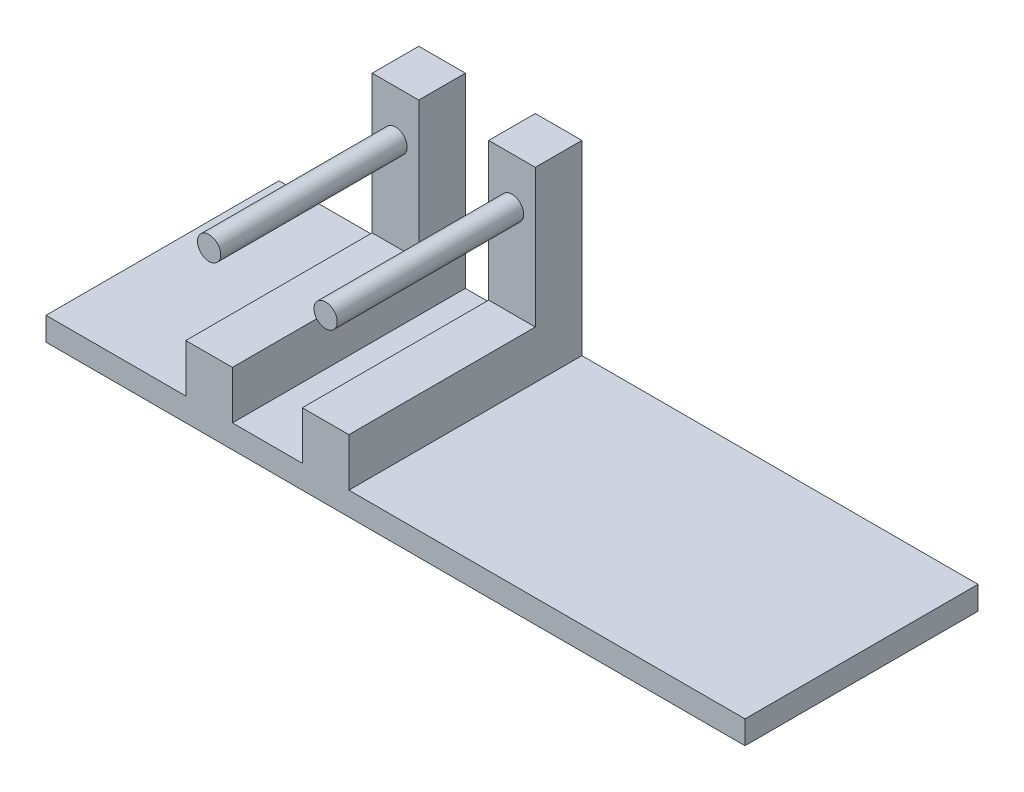
ISO-10303-21;
HEADER;
FILE_DESCRIPTION(('STEP AP214'),'2;1');
FILE_NAME('part.step','',(''),(''),'','','');
FILE_SCHEMA(('AUTOMOTIVE_DESIGN { 1 0 10303 214 1 1 1 1 }'));
ENDSEC;
DATA;
#1=APPLICATION_CONTEXT('core data for automotive mechanical design processes');
#2=APPLICATION_PROTOCOL_DEFINITION('international standard','automotive_design',2000,#1);
#3=PRODUCT_CONTEXT('',#1,'mechanical');
#4=PRODUCT('Part','Part','',(#3));
#5=PRODUCT_RELATED_PRODUCT_CATEGORY('part','',(#4));
#6=PRODUCT_DEFINITION_FORMATION('','',#4);
#7=PRODUCT_DEFINITION_CONTEXT('part definition',#1,'design');
#8=PRODUCT_DEFINITION('design','',#6,#7);
#9=PRODUCT_DEFINITION_SHAPE('','',#8);
#10=(LENGTH_UNIT() NAMED_UNIT(*) SI_UNIT(.MILLI.,.METRE.));
#11=(NAMED_UNIT(*) PLANE_ANGLE_UNIT() SI_UNIT($,.RADIAN.));
#12=(NAMED_UNIT(*) SI_UNIT($,.STERADIAN.) SOLID_ANGLE_UNIT());
#13=UNCERTAINTY_MEASURE_WITH_UNIT(LENGTH_MEASURE(1.E-05),#10,'distance_accuracy_value','');
#14=(GEOMETRIC_REPRESENTATION_CONTEXT(3) GLOBAL_UNCERTAINTY_ASSIGNED_CONTEXT((#13)) GLOBAL_UNIT_ASSIGNED_CONTEXT((#10,
#11,#12)) REPRESENTATION_CONTEXT('',''));
#15=CARTESIAN_POINT('',(0.,0.,0.));
#16=DIRECTION('',(0.,0.,1.));
#17=DIRECTION('',(1.,0.,0.));
#18=AXIS2_PLACEMENT_3D('',#15,#16,#17);
#19=CARTESIAN_POINT('',(55.,45.,50.));
#20=DIRECTION('',(0.,-1.,0.));
#21=DIRECTION('',(0.,0.,-1.));
#22=AXIS2_PLACEMENT_3D('',#19,#20,#21);
#23=PLANE('',#22);
#24=DIRECTION('',(-1.,0.,0.));
#25=VECTOR('',#24,1.);
#26=CARTESIAN_POINT('',(30.,45.,10.));
#27=LINE('',#26,#25);
#28=CARTESIAN_POINT('',(65.,45.,10.));
#29=VERTEX_POINT('',#28);
#30=CARTESIAN_POINT('',(55.,45.,10.));
#31=VERTEX_POINT('',#30);
#32=EDGE_CURVE('E167',#29,#31,#27,.T.);
#33=ORIENTED_EDGE('',*,*,#32,.F.);
#34=DIRECTION('',(0.,0.,-1.));
#35=VECTOR('',#34,1.);
#36=CARTESIAN_POINT('',(65.,45.,50.));
#37=LINE('',#36,#35);
#38=CARTESIAN_POINT('',(65.,45.,0.));
#39=VERTEX_POINT('',#38);
#40=EDGE_CURVE('E249',#29,#39,#37,.T.);
#41=ORIENTED_EDGE('',*,*,#40,.T.);
#42=DIRECTION('',(-1.,0.,0.));
#43=VECTOR('',#42,1.);
#44=CARTESIAN_POINT('',(55.,45.,0.));
#45=LINE('',#44,#43);
#46=CARTESIAN_POINT('',(55.,45.,0.));
#47=VERTEX_POINT('',#46);
#48=EDGE_CURVE('E216',#39,#47,#45,.T.);
#49=ORIENTED_EDGE('',*,*,#48,.T.);
#50=DIRECTION('',(0.,0.,-1.));
#51=VECTOR('',#50,1.);
#52=CARTESIAN_POINT('',(55.,45.,50.));
#53=LINE('',#52,#51);
#54=EDGE_CURVE('E247',#31,#47,#53,.T.);
#55=ORIENTED_EDGE('',*,*,#54,.F.);
#56=EDGE_LOOP('',(#33,#41,#49,#55));
#57=FACE_BOUND('',#56,.T.);
#58=ADVANCED_FACE('F32',(#57),#23,.F.);
#59=CARTESIAN_POINT('',(30.,45.,50.));
#60=DIRECTION('',(0.,-1.,0.));
#61=DIRECTION('',(0.,0.,-1.));
#62=AXIS2_PLACEMENT_3D('',#59,#60,#61);
#63=PLANE('',#62);
#64=CARTESIAN_POINT('',(40.,45.,10.));
#65=VERTEX_POINT('',#64);
#66=CARTESIAN_POINT('',(30.,45.,10.));
#67=VERTEX_POINT('',#66);
#68=EDGE_CURVE('E157',#65,#67,#27,.T.);
#69=ORIENTED_EDGE('',*,*,#68,.F.);
#70=DIRECTION('',(0.,0.,-1.));
#71=VECTOR('',#70,1.);
#72=CARTESIAN_POINT('',(40.,45.,50.));
#73=LINE('',#72,#71);
#74=CARTESIAN_POINT('',(40.,45.,0.));
#75=VERTEX_POINT('',#74);
#76=EDGE_CURVE('E239',#65,#75,#73,.T.);
#77=ORIENTED_EDGE('',*,*,#76,.T.);
#78=DIRECTION('',(-1.,0.,0.));
#79=VECTOR('',#78,1.);
#80=CARTESIAN_POINT('',(30.,45.,0.));
#81=LINE('',#80,#79);
#82=CARTESIAN_POINT('',(30.,45.,0.));
#83=VERTEX_POINT('',#82);
#84=EDGE_CURVE('E226',#75,#83,#81,.T.);
#85=ORIENTED_EDGE('',*,*,#84,.T.);
#86=DIRECTION('',(0.,0.,-1.));
#87=VECTOR('',#86,1.);
#88=CARTESIAN_POINT('',(30.,45.,50.));
#89=LINE('',#88,#87);
#90=EDGE_CURVE('E237',#67,#83,#89,.T.);
#91=ORIENTED_EDGE('',*,*,#90,.F.);
#92=EDGE_LOOP('',(#69,#77,#85,#91));
#93=FACE_BOUND('',#92,.T.);
#94=ADVANCED_FACE('F293',(#93),#63,.F.);
#95=CARTESIAN_POINT('',(0.,0.,50.));
#96=DIRECTION('',(1.,0.,0.));
#97=DIRECTION('',(0.,0.,-1.));
#98=AXIS2_PLACEMENT_3D('',#95,#96,#97);
#99=PLANE('',#98);
#100=DIRECTION('',(0.,-1.,0.));
#101=VECTOR('',#100,1.);
#102=CARTESIAN_POINT('',(0.,0.,0.));
#103=LINE('',#102,#101);
#104=CARTESIAN_POINT('',(0.,5.,0.));
#105=VERTEX_POINT('',#104);
#106=CARTESIAN_POINT('',(0.,0.,0.));
#107=VERTEX_POINT('',#106);
#108=EDGE_CURVE('E180',#105,#107,#103,.T.);
#109=ORIENTED_EDGE('',*,*,#108,.T.);
#110=DIRECTION('',(0.,0.,-1.));
#111=VECTOR('',#110,1.);
#112=CARTESIAN_POINT('',(0.,0.,50.));
#113=LINE('',#112,#111);
#114=CARTESIAN_POINT('',(0.,0.,50.));
#115=VERTEX_POINT('',#114);
#116=EDGE_CURVE('E40',#115,#107,#113,.T.);
#117=ORIENTED_EDGE('',*,*,#116,.F.);
#118=DIRECTION('',(0.,-1.,0.));
#119=VECTOR('',#118,1.);
#120=CARTESIAN_POINT('',(0.,0.,50.));
#121=LINE('',#120,#119);
#122=CARTESIAN_POINT('',(0.,5.,50.));
#123=VERTEX_POINT('',#122);
#124=EDGE_CURVE('E181',#123,#115,#121,.T.);
#125=ORIENTED_EDGE('',*,*,#124,.F.);
#126=DIRECTION('',(0.,0.,-1.));
#127=VECTOR('',#126,1.);
#128=CARTESIAN_POINT('',(0.,5.,50.));
#129=LINE('',#128,#127);
#130=EDGE_CURVE('E204',#123,#105,#129,.T.);
#131=ORIENTED_EDGE('',*,*,#130,.T.);
#132=EDGE_LOOP('',(#109,#117,#125,#131));
#133=FACE_BOUND('',#132,.T.);
#134=ADVANCED_FACE('F34',(#133),#99,.F.);
#135=CARTESIAN_POINT('',(0.,0.,50.));
#136=DIRECTION('',(0.,1.,0.));
#137=DIRECTION('',(0.,0.,1.));
#138=AXIS2_PLACEMENT_3D('',#135,#136,#137);
#139=PLANE('',#138);
#140=DIRECTION('',(1.,0.,0.));
#141=VECTOR('',#140,1.);
#142=CARTESIAN_POINT('',(0.,0.,0.));
#143=LINE('',#142,#141);
#144=CARTESIAN_POINT('',(150.,0.,0.));
#145=VERTEX_POINT('',#144);
#146=EDGE_CURVE('E207',#107,#145,#143,.T.);
#147=ORIENTED_EDGE('',*,*,#146,.T.);
#148=DIRECTION('',(0.,0.,-1.));
#149=VECTOR('',#148,1.);
#150=CARTESIAN_POINT('',(150.,0.,50.));
#151=LINE('',#150,#149);
#152=CARTESIAN_POINT('',(150.,0.,50.));
#153=VERTEX_POINT('',#152);
#154=EDGE_CURVE('E257',#153,#145,#151,.T.);
#155=ORIENTED_EDGE('',*,*,#154,.F.);
#156=DIRECTION('',(1.,0.,0.));
#157=VECTOR('',#156,1.);
#158=CARTESIAN_POINT('',(0.,0.,50.));
#159=LINE('',#158,#157);
#160=EDGE_CURVE('E184',#115,#153,#159,.T.);
#161=ORIENTED_EDGE('',*,*,#160,.F.);
#162=ORIENTED_EDGE('',*,*,#116,.T.);
#163=EDGE_LOOP('',(#147,#155,#161,#162));
#164=FACE_BOUND('',#163,.T.);
#165=ADVANCED_FACE('F262',(#164),#139,.F.);
#166=CARTESIAN_POINT('',(150.,0.,50.));
#167=DIRECTION('',(-1.,0.,0.));
#168=DIRECTION('',(0.,0.,1.));
#169=AXIS2_PLACEMENT_3D('',#166,#167,#168);
#170=PLANE('',#169);
#171=DIRECTION('',(0.,1.,0.));
#172=VECTOR('',#171,1.);
#173=CARTESIAN_POINT('',(150.,0.,0.));
#174=LINE('',#173,#172);
#175=CARTESIAN_POINT('',(150.,5.,0.));
#176=VERTEX_POINT('',#175);
#177=EDGE_CURVE('E209',#145,#176,#174,.T.);
#178=ORIENTED_EDGE('',*,*,#177,.T.);
#179=DIRECTION('',(0.,0.,-1.));
#180=VECTOR('',#179,1.);
#181=CARTESIAN_POINT('',(150.,5.,50.));
#182=LINE('',#181,#180);
#183=CARTESIAN_POINT('',(150.,5.,50.));
#184=VERTEX_POINT('',#183);
#185=EDGE_CURVE('E254',#184,#176,#182,.T.);
#186=ORIENTED_EDGE('',*,*,#185,.F.);
#187=DIRECTION('',(0.,1.,0.));
#188=VECTOR('',#187,1.);
#189=CARTESIAN_POINT('',(150.,0.,50.));
#190=LINE('',#189,#188);
#191=EDGE_CURVE('E187',#153,#184,#190,.T.);
#192=ORIENTED_EDGE('',*,*,#191,.F.);
#193=ORIENTED_EDGE('',*,*,#154,.T.);
#194=EDGE_LOOP('',(#178,#186,#192,#193));
#195=FACE_BOUND('',#194,.T.);
#196=ADVANCED_FACE('F277',(#195),#170,.F.);
#197=CARTESIAN_POINT('',(65.,5.,50.));
#198=DIRECTION('',(0.,-1.,0.));
#199=DIRECTION('',(0.,0.,-1.));
#200=AXIS2_PLACEMENT_3D('',#197,#198,#199);
#201=PLANE('',#200);
#202=DIRECTION('',(-1.,0.,0.));
#203=VECTOR('',#202,1.);
#204=CARTESIAN_POINT('',(65.,5.,0.));
#205=LINE('',#204,#203);
#206=CARTESIAN_POINT('',(65.,5.,0.));
#207=VERTEX_POINT('',#206);
#208=EDGE_CURVE('E211',#176,#207,#205,.T.);
#209=ORIENTED_EDGE('',*,*,#208,.T.);
#210=DIRECTION('',(0.,0.,-1.));
#211=VECTOR('',#210,1.);
#212=CARTESIAN_POINT('',(65.,5.,50.));
#213=LINE('',#212,#211);
#214=CARTESIAN_POINT('',(65.,5.,50.));
#215=VERTEX_POINT('',#214);
#216=EDGE_CURVE('E251',#215,#207,#213,.T.);
#217=ORIENTED_EDGE('',*,*,#216,.F.);
#218=DIRECTION('',(-1.,0.,0.));
#219=VECTOR('',#218,1.);
#220=CARTESIAN_POINT('',(65.,5.,50.));
#221=LINE('',#220,#219);
#222=EDGE_CURVE('E189',#184,#215,#221,.T.);
#223=ORIENTED_EDGE('',*,*,#222,.F.);
#224=ORIENTED_EDGE('',*,*,#185,.T.);
#225=EDGE_LOOP('',(#209,#217,#223,#224));
#226=FACE_BOUND('',#225,.T.);
#227=ADVANCED_FACE('F281',(#226),#201,.F.);
#228=CARTESIAN_POINT('',(65.,45.,50.));
#229=DIRECTION('',(-1.,0.,0.));
#230=DIRECTION('',(0.,-1.,0.));
#231=AXIS2_PLACEMENT_3D('',#228,#229,#230);
#232=PLANE('',#231);
#233=DIRECTION('',(0.,1.,0.));
#234=VECTOR('',#233,1.);
#235=CARTESIAN_POINT('',(65.,45.,10.));
#236=LINE('',#235,#234);
#237=CARTESIAN_POINT('',(65.,15.3177878391508,10.));
#238=VERTEX_POINT('',#237);
#239=EDGE_CURVE('E150',#238,#29,#236,.T.);
#240=ORIENTED_EDGE('',*,*,#239,.F.);
#241=DIRECTION('',(0.,0.,1.));
#242=VECTOR('',#241,1.);
#243=CARTESIAN_POINT('',(65.,15.3177878391508,10.));
#244=LINE('',#243,#242);
#245=CARTESIAN_POINT('',(65.,15.3177878391508,50.));
#246=VERTEX_POINT('',#245);
#247=EDGE_CURVE('E166',#238,#246,#244,.T.);
#248=ORIENTED_EDGE('',*,*,#247,.T.);
#249=DIRECTION('',(0.,1.,0.));
#250=VECTOR('',#249,1.);
#251=CARTESIAN_POINT('',(65.,45.,50.));
#252=LINE('',#251,#250);
#253=EDGE_CURVE('E191',#215,#246,#252,.T.);
#254=ORIENTED_EDGE('',*,*,#253,.F.);
#255=ORIENTED_EDGE('',*,*,#216,.T.);
#256=DIRECTION('',(0.,1.,0.));
#257=VECTOR('',#256,1.);
#258=CARTESIAN_POINT('',(65.,45.,0.));
#259=LINE('',#258,#257);
#260=EDGE_CURVE('E213',#207,#39,#259,.T.);
#261=ORIENTED_EDGE('',*,*,#260,.T.);
#262=ORIENTED_EDGE('',*,*,#40,.F.);
#263=EDGE_LOOP('',(#240,#248,#254,#255,#261,#262));
#264=FACE_BOUND('',#263,.T.);
#265=ADVANCED_FACE('F315',(#264),#232,.F.);
#266=CARTESIAN_POINT('',(55.,5.,50.));
#267=DIRECTION('',(1.,0.,0.));
#268=DIRECTION('',(0.,0.,-1.));
#269=AXIS2_PLACEMENT_3D('',#266,#267,#268);
#270=PLANE('',#269);
#271=DIRECTION('',(0.,-1.,0.));
#272=VECTOR('',#271,1.);
#273=CARTESIAN_POINT('',(55.,5.,50.));
#274=LINE('',#273,#272);
#275=CARTESIAN_POINT('',(55.,15.3177878391508,50.));
#276=VERTEX_POINT('',#275);
#277=CARTESIAN_POINT('',(55.,5.,50.));
#278=VERTEX_POINT('',#277);
#279=EDGE_CURVE('E194',#276,#278,#274,.T.);
#280=ORIENTED_EDGE('',*,*,#279,.F.);
#281=DIRECTION('',(0.,0.,-1.));
#282=VECTOR('',#281,1.);
#283=CARTESIAN_POINT('',(55.,15.3177878391508,50.));
#284=LINE('',#283,#282);
#285=CARTESIAN_POINT('',(55.,15.3177878391508,10.));
#286=VERTEX_POINT('',#285);
#287=EDGE_CURVE('E55',#276,#286,#284,.T.);
#288=ORIENTED_EDGE('',*,*,#287,.T.);
#289=DIRECTION('',(0.,-1.,0.));
#290=VECTOR('',#289,1.);
#291=CARTESIAN_POINT('',(55.,5.,10.));
#292=LINE('',#291,#290);
#293=EDGE_CURVE('E178',#31,#286,#292,.T.);
#294=ORIENTED_EDGE('',*,*,#293,.F.);
#295=ORIENTED_EDGE('',*,*,#54,.T.);
#296=DIRECTION('',(0.,-1.,0.));
#297=VECTOR('',#296,1.);
#298=CARTESIAN_POINT('',(55.,5.,0.));
#299=LINE('',#298,#297);
#300=CARTESIAN_POINT('',(55.,5.,0.));
#301=VERTEX_POINT('',#300);
#302=EDGE_CURVE('E219',#47,#301,#299,.T.);
#303=ORIENTED_EDGE('',*,*,#302,.T.);
#304=DIRECTION('',(0.,0.,-1.));
#305=VECTOR('',#304,1.);
#306=CARTESIAN_POINT('',(55.,5.,50.));
#307=LINE('',#306,#305);
#308=EDGE_CURVE('E244',#278,#301,#307,.T.);
#309=ORIENTED_EDGE('',*,*,#308,.F.);
#310=EDGE_LOOP('',(#280,#288,#294,#295,#303,#309));
#311=FACE_BOUND('',#310,.T.);
#312=ADVANCED_FACE('F307',(#311),#270,.F.);
#313=CARTESIAN_POINT('',(40.,5.,50.));
#314=DIRECTION('',(0.,-1.,0.));
#315=DIRECTION('',(1.,0.,0.));
#316=AXIS2_PLACEMENT_3D('',#313,#314,#315);
#317=PLANE('',#316);
#318=DIRECTION('',(-1.,0.,0.));
#319=VECTOR('',#318,1.);
#320=CARTESIAN_POINT('',(40.,5.,0.));
#321=LINE('',#320,#319);
#322=CARTESIAN_POINT('',(40.,5.,0.));
#323=VERTEX_POINT('',#322);
#324=EDGE_CURVE('E221',#301,#323,#321,.T.);
#325=ORIENTED_EDGE('',*,*,#324,.T.);
#326=DIRECTION('',(0.,0.,-1.));
#327=VECTOR('',#326,1.);
#328=CARTESIAN_POINT('',(40.,5.,50.));
#329=LINE('',#328,#327);
#330=CARTESIAN_POINT('',(40.,5.,50.));
#331=VERTEX_POINT('',#330);
#332=EDGE_CURVE('E241',#331,#323,#329,.T.);
#333=ORIENTED_EDGE('',*,*,#332,.F.);
#334=DIRECTION('',(-1.,0.,0.));
#335=VECTOR('',#334,1.);
#336=CARTESIAN_POINT('',(40.,5.,50.));
#337=LINE('',#336,#335);
#338=EDGE_CURVE('E196',#278,#331,#337,.T.);
#339=ORIENTED_EDGE('',*,*,#338,.F.);
#340=ORIENTED_EDGE('',*,*,#308,.T.);
#341=EDGE_LOOP('',(#325,#333,#339,#340));
#342=FACE_BOUND('',#341,.T.);
#343=ADVANCED_FACE('F301',(#342),#317,.F.);
#344=CARTESIAN_POINT('',(40.,45.,50.));
#345=DIRECTION('',(-1.,0.,0.));
#346=DIRECTION('',(0.,-1.,0.));
#347=AXIS2_PLACEMENT_3D('',#344,#345,#346);
#348=PLANE('',#347);
#349=DIRECTION('',(0.,1.,0.));
#350=VECTOR('',#349,1.);
#351=CARTESIAN_POINT('',(40.,45.,10.));
#352=LINE('',#351,#350);
#353=CARTESIAN_POINT('',(40.,15.3177878391508,10.));
#354=VERTEX_POINT('',#353);
#355=EDGE_CURVE('E176',#354,#65,#352,.T.);
#356=ORIENTED_EDGE('',*,*,#355,.F.);
#357=DIRECTION('',(0.,0.,1.));
#358=VECTOR('',#357,1.);
#359=CARTESIAN_POINT('',(40.,15.3177878391508,50.));
#360=LINE('',#359,#358);
#361=CARTESIAN_POINT('',(40.,15.3177878391508,50.));
#362=VERTEX_POINT('',#361);
#363=EDGE_CURVE('E147',#354,#362,#360,.T.);
#364=ORIENTED_EDGE('',*,*,#363,.T.);
#365=DIRECTION('',(0.,1.,0.));
#366=VECTOR('',#365,1.);
#367=CARTESIAN_POINT('',(40.,45.,50.));
#368=LINE('',#367,#366);
#369=EDGE_CURVE('E198',#331,#362,#368,.T.);
#370=ORIENTED_EDGE('',*,*,#369,.F.);
#371=ORIENTED_EDGE('',*,*,#332,.T.);
#372=DIRECTION('',(0.,1.,0.));
#373=VECTOR('',#372,1.);
#374=CARTESIAN_POINT('',(40.,45.,0.));
#375=LINE('',#374,#373);
#376=EDGE_CURVE('E223',#323,#75,#375,.T.);
#377=ORIENTED_EDGE('',*,*,#376,.T.);
#378=ORIENTED_EDGE('',*,*,#76,.F.);
#379=EDGE_LOOP('',(#356,#364,#370,#371,#377,#378));
#380=FACE_BOUND('',#379,.T.);
#381=ADVANCED_FACE('F296',(#380),#348,.F.);
#382=CARTESIAN_POINT('',(30.,5.,50.));
#383=DIRECTION('',(1.,0.,0.));
#384=DIRECTION('',(0.,0.,-1.));
#385=AXIS2_PLACEMENT_3D('',#382,#383,#384);
#386=PLANE('',#385);
#387=DIRECTION('',(0.,-1.,0.));
#388=VECTOR('',#387,1.);
#389=CARTESIAN_POINT('',(30.,5.,50.));
#390=LINE('',#389,#388);
#391=CARTESIAN_POINT('',(30.,15.3177878391508,50.));
#392=VERTEX_POINT('',#391);
#393=CARTESIAN_POINT('',(30.,5.,50.));
#394=VERTEX_POINT('',#393);
#395=EDGE_CURVE('E165',#392,#394,#390,.T.);
#396=ORIENTED_EDGE('',*,*,#395,.F.);
#397=DIRECTION('',(0.,0.,1.));
#398=VECTOR('',#397,1.);
#399=CARTESIAN_POINT('',(30.,15.3177878391508,10.));
#400=LINE('',#399,#398);
#401=CARTESIAN_POINT('',(30.,15.3177878391508,10.));
#402=VERTEX_POINT('',#401);
#403=EDGE_CURVE('E47',#402,#392,#400,.T.);
#404=ORIENTED_EDGE('',*,*,#403,.F.);
#405=DIRECTION('',(0.,-1.,0.));
#406=VECTOR('',#405,1.);
#407=CARTESIAN_POINT('',(30.,45.,10.));
#408=LINE('',#407,#406);
#409=EDGE_CURVE('E154',#67,#402,#408,.T.);
#410=ORIENTED_EDGE('',*,*,#409,.F.);
#411=ORIENTED_EDGE('',*,*,#90,.T.);
#412=DIRECTION('',(0.,-1.,0.));
#413=VECTOR('',#412,1.);
#414=CARTESIAN_POINT('',(30.,5.,0.));
#415=LINE('',#414,#413);
#416=CARTESIAN_POINT('',(30.,5.,0.));
#417=VERTEX_POINT('',#416);
#418=EDGE_CURVE('E229',#83,#417,#415,.T.);
#419=ORIENTED_EDGE('',*,*,#418,.T.);
#420=DIRECTION('',(0.,0.,-1.));
#421=VECTOR('',#420,1.);
#422=CARTESIAN_POINT('',(30.,5.,50.));
#423=LINE('',#422,#421);
#424=EDGE_CURVE('E234',#394,#417,#423,.T.);
#425=ORIENTED_EDGE('',*,*,#424,.F.);
#426=EDGE_LOOP('',(#396,#404,#410,#411,#419,#425));
#427=FACE_BOUND('',#426,.T.);
#428=ADVANCED_FACE('F163',(#427),#386,.F.);
#429=CARTESIAN_POINT('',(0.,5.,50.));
#430=DIRECTION('',(0.,-1.,0.));
#431=DIRECTION('',(0.,0.,-1.));
#432=AXIS2_PLACEMENT_3D('',#429,#430,#431);
#433=PLANE('',#432);
#434=DIRECTION('',(-1.,0.,0.));
#435=VECTOR('',#434,1.);
#436=CARTESIAN_POINT('',(0.,5.,0.));
#437=LINE('',#436,#435);
#438=EDGE_CURVE('E185',#417,#105,#437,.T.);
#439=ORIENTED_EDGE('',*,*,#438,.T.);
#440=ORIENTED_EDGE('',*,*,#130,.F.);
#441=DIRECTION('',(-1.,0.,0.));
#442=VECTOR('',#441,1.);
#443=CARTESIAN_POINT('',(0.,5.,50.));
#444=LINE('',#443,#442);
#445=EDGE_CURVE('E202',#394,#123,#444,.T.);
#446=ORIENTED_EDGE('',*,*,#445,.F.);
#447=ORIENTED_EDGE('',*,*,#424,.T.);
#448=EDGE_LOOP('',(#439,#440,#446,#447));
#449=FACE_BOUND('',#448,.T.);
#450=ADVANCED_FACE('F288',(#449),#433,.F.);
#451=CARTESIAN_POINT('',(0.,0.,50.));
#452=DIRECTION('',(0.,0.,-1.));
#453=DIRECTION('',(-1.,0.,0.));
#454=AXIS2_PLACEMENT_3D('',#451,#452,#453);
#455=PLANE('',#454);
#456=ORIENTED_EDGE('',*,*,#253,.T.);
#457=DIRECTION('',(-1.,0.,0.));
#458=VECTOR('',#457,1.);
#459=CARTESIAN_POINT('',(0.,15.3177878391508,50.));
#460=LINE('',#459,#458);
#461=EDGE_CURVE('E11',#246,#276,#460,.T.);
#462=ORIENTED_EDGE('',*,*,#461,.T.);
#463=ORIENTED_EDGE('',*,*,#279,.T.);
#464=ORIENTED_EDGE('',*,*,#338,.T.);
#465=ORIENTED_EDGE('',*,*,#369,.T.);
#466=DIRECTION('',(1.,0.,0.));
#467=VECTOR('',#466,1.);
#468=CARTESIAN_POINT('',(30.,15.3177878391508,50.));
#469=LINE('',#468,#467);
#470=EDGE_CURVE('E160',#392,#362,#469,.T.);
#471=ORIENTED_EDGE('',*,*,#470,.F.);
#472=ORIENTED_EDGE('',*,*,#395,.T.);
#473=ORIENTED_EDGE('',*,*,#445,.T.);
#474=ORIENTED_EDGE('',*,*,#124,.T.);
#475=ORIENTED_EDGE('',*,*,#160,.T.);
#476=ORIENTED_EDGE('',*,*,#191,.T.);
#477=ORIENTED_EDGE('',*,*,#222,.T.);
#478=EDGE_LOOP('',(#456,#462,#463,#464,#465,#471,#472,#473,#474,#475,#476,#477));
#479=FACE_BOUND('',#478,.T.);
#480=ADVANCED_FACE('F285',(#479),#455,.F.);
#481=CARTESIAN_POINT('',(0.,0.,0.));
#482=DIRECTION('',(0.,0.,-1.));
#483=DIRECTION('',(-1.,0.,0.));
#484=AXIS2_PLACEMENT_3D('',#481,#482,#483);
#485=PLANE('',#484);
#486=ORIENTED_EDGE('',*,*,#108,.F.);
#487=ORIENTED_EDGE('',*,*,#438,.F.);
#488=ORIENTED_EDGE('',*,*,#418,.F.);
#489=ORIENTED_EDGE('',*,*,#84,.F.);
#490=ORIENTED_EDGE('',*,*,#376,.F.);
#491=ORIENTED_EDGE('',*,*,#324,.F.);
#492=ORIENTED_EDGE('',*,*,#302,.F.);
#493=ORIENTED_EDGE('',*,*,#48,.F.);
#494=ORIENTED_EDGE('',*,*,#260,.F.);
#495=ORIENTED_EDGE('',*,*,#208,.F.);
#496=ORIENTED_EDGE('',*,*,#177,.F.);
#497=ORIENTED_EDGE('',*,*,#146,.F.);
#498=EDGE_LOOP('',(#486,#487,#488,#489,#490,#491,#492,#493,#494,#495,#496,#497));
#499=FACE_BOUND('',#498,.T.);
#500=ADVANCED_FACE('F270',(#499),#485,.T.);
#501=CARTESIAN_POINT('',(30.,15.3177878391508,10.));
#502=DIRECTION('',(0.,-1.,0.));
#503=DIRECTION('',(0.,0.,-1.));
#504=AXIS2_PLACEMENT_3D('',#501,#502,#503);
#505=PLANE('',#504);
#506=ORIENTED_EDGE('',*,*,#461,.F.);
#507=ORIENTED_EDGE('',*,*,#247,.F.);
#508=DIRECTION('',(1.,0.,0.));
#509=VECTOR('',#508,1.);
#510=CARTESIAN_POINT('',(30.,15.3177878391508,10.));
#511=LINE('',#510,#509);
#512=EDGE_CURVE('E151',#286,#238,#511,.T.);
#513=ORIENTED_EDGE('',*,*,#512,.F.);
#514=ORIENTED_EDGE('',*,*,#287,.F.);
#515=EDGE_LOOP('',(#506,#507,#513,#514));
#516=FACE_BOUND('',#515,.T.);
#517=ADVANCED_FACE('F317',(#516),#505,.F.);
#518=CARTESIAN_POINT('',(60.,35.,10.));
#519=DIRECTION('',(0.,0.,1.));
#520=DIRECTION('',(1.,0.,0.));
#521=AXIS2_PLACEMENT_3D('',#518,#519,#520);
#522=CYLINDRICAL_SURFACE('',#521,2.5);
#523=CARTESIAN_POINT('',(60.,35.,10.));
#524=DIRECTION('',(0.,0.,1.));
#525=DIRECTION('',(1.,0.,0.));
#526=AXIS2_PLACEMENT_3D('',#523,#524,#525);
#527=CIRCLE('',#526,2.5);
#528=CARTESIAN_POINT('',(62.5,35.,10.));
#529=VERTEX_POINT('',#528);
#530=EDGE_CURVE('E325',#529,#529,#527,.T.);
#531=ORIENTED_EDGE('',*,*,#530,.T.);
#532=EDGE_LOOP('',(#531));
#533=FACE_BOUND('',#532,.T.);
#534=CARTESIAN_POINT('',(60.,35.,50.));
#535=DIRECTION('',(0.,0.,1.));
#536=DIRECTION('',(1.,0.,0.));
#537=AXIS2_PLACEMENT_3D('',#534,#535,#536);
#538=CIRCLE('',#537,2.5);
#539=CARTESIAN_POINT('',(62.5,35.,50.));
#540=VERTEX_POINT('',#539);
#541=EDGE_CURVE('E327',#540,#540,#538,.T.);
#542=ORIENTED_EDGE('',*,*,#541,.F.);
#543=EDGE_LOOP('',(#542));
#544=FACE_BOUND('',#543,.T.);
#545=ADVANCED_FACE('F333',(#533,#544),#522,.T.);
#546=CARTESIAN_POINT('',(0.,0.,10.));
#547=DIRECTION('',(0.,0.,1.));
#548=DIRECTION('',(1.,0.,0.));
#549=AXIS2_PLACEMENT_3D('',#546,#547,#548);
#550=PLANE('',#549);
#551=ORIENTED_EDGE('',*,*,#530,.F.);
#552=EDGE_LOOP('',(#551));
#553=FACE_BOUND('',#552,.T.);
#554=ORIENTED_EDGE('',*,*,#293,.T.);
#555=ORIENTED_EDGE('',*,*,#512,.T.);
#556=ORIENTED_EDGE('',*,*,#239,.T.);
#557=ORIENTED_EDGE('',*,*,#32,.T.);
#558=EDGE_LOOP('',(#554,#555,#556,#557));
#559=FACE_BOUND('',#558,.T.);
#560=ADVANCED_FACE('F336',(#553,#559),#550,.T.);
#561=CARTESIAN_POINT('',(35.,35.,10.));
#562=DIRECTION('',(0.,0.,1.));
#563=DIRECTION('',(1.,0.,0.));
#564=AXIS2_PLACEMENT_3D('',#561,#562,#563);
#565=CIRCLE('',#564,2.5);
#566=CARTESIAN_POINT('',(37.5,35.,10.));
#567=VERTEX_POINT('',#566);
#568=EDGE_CURVE('E318',#567,#567,#565,.T.);
#569=ORIENTED_EDGE('',*,*,#568,.F.);
#570=EDGE_LOOP('',(#569));
#571=FACE_BOUND('',#570,.T.);
#572=ORIENTED_EDGE('',*,*,#355,.T.);
#573=ORIENTED_EDGE('',*,*,#68,.T.);
#574=ORIENTED_EDGE('',*,*,#409,.T.);
#575=EDGE_CURVE('E143',#402,#354,#511,.T.);
#576=ORIENTED_EDGE('',*,*,#575,.T.);
#577=EDGE_LOOP('',(#572,#573,#574,#576));
#578=FACE_BOUND('',#577,.T.);
#579=ADVANCED_FACE('F155',(#571,#578),#550,.T.);
#580=ORIENTED_EDGE('',*,*,#575,.F.);
#581=ORIENTED_EDGE('',*,*,#403,.T.);
#582=ORIENTED_EDGE('',*,*,#470,.T.);
#583=ORIENTED_EDGE('',*,*,#363,.F.);
#584=EDGE_LOOP('',(#580,#581,#582,#583));
#585=FACE_BOUND('',#584,.T.);
#586=ADVANCED_FACE('F145',(#585),#505,.F.);
#587=CARTESIAN_POINT('',(35.,35.,10.));
#588=DIRECTION('',(0.,0.,1.));
#589=DIRECTION('',(1.,0.,0.));
#590=AXIS2_PLACEMENT_3D('',#587,#588,#589);
#591=CYLINDRICAL_SURFACE('',#590,2.5);
#592=ORIENTED_EDGE('',*,*,#568,.T.);
#593=EDGE_LOOP('',(#592));
#594=FACE_BOUND('',#593,.T.);
#595=CARTESIAN_POINT('',(35.,35.,50.));
#596=DIRECTION('',(0.,0.,1.));
#597=DIRECTION('',(1.,0.,0.));
#598=AXIS2_PLACEMENT_3D('',#595,#596,#597);
#599=CIRCLE('',#598,2.5);
#600=CARTESIAN_POINT('',(37.5,35.,50.));
#601=VERTEX_POINT('',#600);
#602=EDGE_CURVE('E320',#601,#601,#599,.T.);
#603=ORIENTED_EDGE('',*,*,#602,.F.);
#604=EDGE_LOOP('',(#603));
#605=FACE_BOUND('',#604,.T.);
#606=ADVANCED_FACE('F454',(#594,#605),#591,.T.);
#607=ORIENTED_EDGE('',*,*,#541,.T.);
#608=EDGE_LOOP('',(#607));
#609=FACE_BOUND('',#608,.T.);
#610=ADVANCED_FACE('F421',(#609),#455,.F.);
#611=ORIENTED_EDGE('',*,*,#602,.T.);
#612=EDGE_LOOP('',(#611));
#613=FACE_BOUND('',#612,.T.);
#614=ADVANCED_FACE('F420',(#613),#455,.F.);
#615=CLOSED_SHELL('',(#58,#94,#134,#165,#196,#227,#265,#312,#343,#381,#428,#450,#480,#500,#517,
#545,#560,#579,#586,#606,#610,#614));
#616=MANIFOLD_SOLID_BREP('B2',#615);
#617=ADVANCED_BREP_SHAPE_REPRESENTATION('',(#18,#616),#14);
#618=SHAPE_DEFINITION_REPRESENTATION(#9,#617);
ENDSEC;
END-ISO-10303-21;
